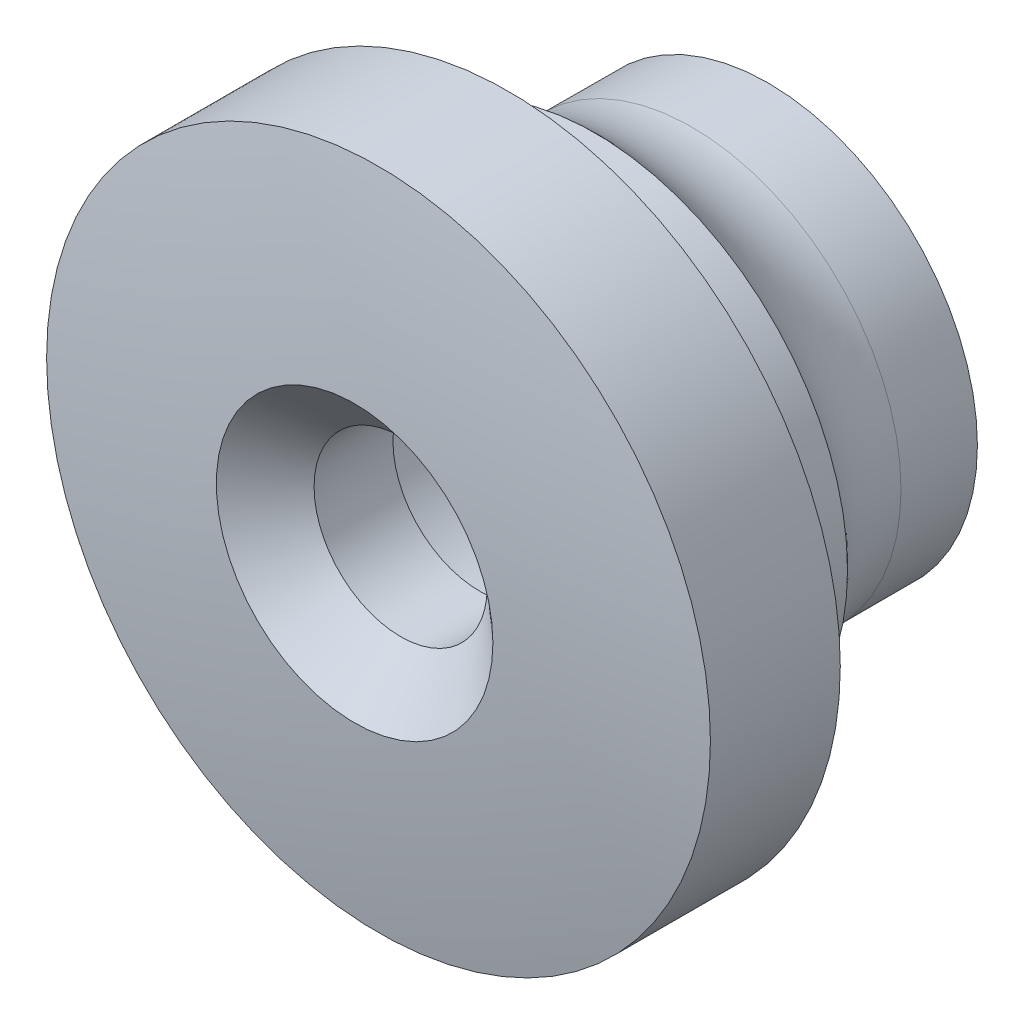
ISO-10303-21;
HEADER;
FILE_DESCRIPTION(('STEP AP214'),'2;1');
FILE_NAME('part.step','',(''),(''),'','','');
FILE_SCHEMA(('AUTOMOTIVE_DESIGN { 1 0 10303 214 1 1 1 1 }'));
ENDSEC;
DATA;
#1=APPLICATION_CONTEXT('core data for automotive mechanical design processes');
#2=APPLICATION_PROTOCOL_DEFINITION('international standard','automotive_design',2000,#1);
#3=PRODUCT_CONTEXT('',#1,'mechanical');
#4=PRODUCT('Part','Part','',(#3));
#5=PRODUCT_RELATED_PRODUCT_CATEGORY('part','',(#4));
#6=PRODUCT_DEFINITION_FORMATION('','',#4);
#7=PRODUCT_DEFINITION_CONTEXT('part definition',#1,'design');
#8=PRODUCT_DEFINITION('design','',#6,#7);
#9=PRODUCT_DEFINITION_SHAPE('','',#8);
#10=(LENGTH_UNIT() NAMED_UNIT(*) SI_UNIT(.MILLI.,.METRE.));
#11=(NAMED_UNIT(*) PLANE_ANGLE_UNIT() SI_UNIT($,.RADIAN.));
#12=(NAMED_UNIT(*) SI_UNIT($,.STERADIAN.) SOLID_ANGLE_UNIT());
#13=UNCERTAINTY_MEASURE_WITH_UNIT(LENGTH_MEASURE(1.E-05),#10,'distance_accuracy_value','');
#14=(GEOMETRIC_REPRESENTATION_CONTEXT(3) GLOBAL_UNCERTAINTY_ASSIGNED_CONTEXT((#13)) GLOBAL_UNIT_ASSIGNED_CONTEXT((#10,
#11,#12)) REPRESENTATION_CONTEXT('',''));
#15=CARTESIAN_POINT('',(0.,0.,0.));
#16=DIRECTION('',(0.,0.,1.));
#17=DIRECTION('',(1.,0.,0.));
#18=AXIS2_PLACEMENT_3D('',#15,#16,#17);
#19=CARTESIAN_POINT('',(0.,0.,0.));
#20=DIRECTION('',(0.,0.,-1.));
#21=DIRECTION('',(-1.,0.,0.));
#22=AXIS2_PLACEMENT_3D('',#19,#20,#21);
#23=CYLINDRICAL_SURFACE('',#22,3.00000000000001);
#24=CARTESIAN_POINT('',(0.,0.,3.73259543898158));
#25=DIRECTION('',(0.,0.,1.));
#26=DIRECTION('',(1.,0.,0.));
#27=AXIS2_PLACEMENT_3D('',#24,#25,#26);
#28=CIRCLE('',#27,3.00000000000001);
#29=CARTESIAN_POINT('',(3.00000000000003,0.,3.73259543898158));
#30=VERTEX_POINT('',#29);
#31=EDGE_CURVE('E46',#30,#30,#28,.T.);
#32=ORIENTED_EDGE('',*,*,#31,.T.);
#33=EDGE_LOOP('',(#32));
#34=FACE_BOUND('',#33,.T.);
#35=CARTESIAN_POINT('',(0.,0.,1.));
#36=DIRECTION('',(0.,0.,-1.));
#37=DIRECTION('',(-1.,0.,0.));
#38=AXIS2_PLACEMENT_3D('',#35,#36,#37);
#39=CIRCLE('',#38,3.00000000000001);
#40=CARTESIAN_POINT('',(-3.,0.,1.));
#41=VERTEX_POINT('',#40);
#42=EDGE_CURVE('E33',#41,#41,#39,.F.);
#43=ORIENTED_EDGE('',*,*,#42,.F.);
#44=EDGE_LOOP('',(#43));
#45=FACE_BOUND('',#44,.T.);
#46=ADVANCED_FACE('F29',(#34,#45),#23,.F.);
#47=CARTESIAN_POINT('',(0.,0.,0.));
#48=DIRECTION('',(0.,0.,1.));
#49=DIRECTION('',(1.,0.,0.));
#50=AXIS2_PLACEMENT_3D('',#47,#48,#49);
#51=PLANE('',#50);
#52=CARTESIAN_POINT('',(0.,0.,0.));
#53=DIRECTION('',(0.,0.,1.));
#54=DIRECTION('',(1.,0.,0.));
#55=AXIS2_PLACEMENT_3D('',#52,#53,#54);
#56=CIRCLE('',#55,11.5);
#57=CARTESIAN_POINT('',(11.5,0.,0.));
#58=VERTEX_POINT('',#57);
#59=EDGE_CURVE('E52',#58,#58,#56,.T.);
#60=ORIENTED_EDGE('',*,*,#59,.F.);
#61=EDGE_LOOP('',(#60));
#62=FACE_BOUND('',#61,.T.);
#63=CARTESIAN_POINT('',(0.,0.,0.));
#64=DIRECTION('',(0.,0.,-1.));
#65=DIRECTION('',(-1.,0.,0.));
#66=AXIS2_PLACEMENT_3D('',#63,#64,#65);
#67=CIRCLE('',#66,8.75);
#68=CARTESIAN_POINT('',(-8.74999999999999,0.,0.));
#69=VERTEX_POINT('',#68);
#70=EDGE_CURVE('E37',#69,#69,#67,.T.);
#71=ORIENTED_EDGE('',*,*,#70,.F.);
#72=EDGE_LOOP('',(#71));
#73=FACE_BOUND('',#72,.T.);
#74=ADVANCED_FACE('F88',(#62,#73),#51,.F.);
#75=CARTESIAN_POINT('',(0.,0.,4.5));
#76=DIRECTION('',(0.,0.,-1.));
#77=DIRECTION('',(-1.,0.,0.));
#78=AXIS2_PLACEMENT_3D('',#75,#76,#77);
#79=CYLINDRICAL_SURFACE('',#78,11.5);
#80=CARTESIAN_POINT('',(0.,0.,4.5));
#81=DIRECTION('',(0.,0.,1.));
#82=DIRECTION('',(1.,0.,0.));
#83=AXIS2_PLACEMENT_3D('',#80,#81,#82);
#84=CIRCLE('',#83,11.5);
#85=CARTESIAN_POINT('',(11.5,0.,4.5));
#86=VERTEX_POINT('',#85);
#87=EDGE_CURVE('E49',#86,#86,#84,.T.);
#88=ORIENTED_EDGE('',*,*,#87,.F.);
#89=EDGE_LOOP('',(#88));
#90=FACE_BOUND('',#89,.T.);
#91=ORIENTED_EDGE('',*,*,#59,.T.);
#92=EDGE_LOOP('',(#91));
#93=FACE_BOUND('',#92,.T.);
#94=ADVANCED_FACE('F94',(#90,#93),#79,.T.);
#95=CARTESIAN_POINT('',(0.,0.,-61.125));
#96=DIRECTION('',(0.,0.,1.));
#97=DIRECTION('',(1.,0.,0.));
#98=AXIS2_PLACEMENT_3D('',#95,#96,#97);
#99=SPHERICAL_SURFACE('',#98,66.625);
#100=CARTESIAN_POINT('',(0.,0.,5.32750093081577));
#101=DIRECTION('',(0.,0.,-1.));
#102=DIRECTION('',(-1.,0.,0.));
#103=AXIS2_PLACEMENT_3D('',#100,#101,#102);
#104=CIRCLE('',#103,4.79121540320671);
#105=CARTESIAN_POINT('',(4.79121540320731,0.,5.32750093081577));
#106=VERTEX_POINT('',#105);
#107=EDGE_CURVE('E41',#106,#106,#104,.T.);
#108=CARTESIAN_POINT('',(4.79121540320731,0.,5.32750093081577));
#109=CARTESIAN_POINT('',(4.86147602886873,0.,5.32243515059231));
#110=CARTESIAN_POINT('',(4.93172862035082,0.,5.31725793911036));
#111=CARTESIAN_POINT('',(5.07221702827427,0.,5.30668070748564));
#112=CARTESIAN_POINT('',(5.14245284471564,0.,5.30128068734288));
#113=CARTESIAN_POINT('',(5.28290699587557,0.,5.29025789225272));
#114=CARTESIAN_POINT('',(5.35312533059415,0.,5.28463511730533));
#115=CARTESIAN_POINT('',(5.49354381184756,0.,5.27316686930389));
#116=CARTESIAN_POINT('',(5.5637439583824,0.,5.26732139624984));
#117=CARTESIAN_POINT('',(5.70412535697826,0.,5.2554078108127));
#118=CARTESIAN_POINT('',(5.77430660903928,0.,5.24933969842961));
#119=CARTESIAN_POINT('',(5.91464951259078,0.,5.2369808953951));
#120=CARTESIAN_POINT('',(5.98481116408126,0.,5.23069020474369));
#121=CARTESIAN_POINT('',(6.12511416059129,0.,5.21788630846108));
#122=CARTESIAN_POINT('',(6.19525550561084,0.,5.21137310282989));
#123=CARTESIAN_POINT('',(6.33551718348312,0.,5.19812424211809));
#124=CARTESIAN_POINT('',(6.40563751633587,0.,5.19138858703749));
#125=CARTESIAN_POINT('',(6.54585646439003,0.,5.17769489519451));
#126=CARTESIAN_POINT('',(6.61595507959146,0.,5.17073685843213));
#127=CARTESIAN_POINT('',(6.756129887077,0.,5.15659847323081));
#128=CARTESIAN_POINT('',(6.82620607936112,0.,5.14941812479187));
#129=CARTESIAN_POINT('',(6.96633533597162,0.,5.13483518847931));
#130=CARTESIAN_POINT('',(7.03638840029802,0.,5.1274326006057));
#131=CARTESIAN_POINT('',(7.17647069618537,0.,5.11240525990161));
#132=CARTESIAN_POINT('',(7.24649992774633,0.,5.10478050707114));
#133=CARTESIAN_POINT('',(7.38653385353489,0.,5.08930891316642));
#134=CARTESIAN_POINT('',(7.4565385477625,0.,5.08146207209217));
#135=CARTESIAN_POINT('',(7.59652269456328,0.,5.06554638064738));
#136=CARTESIAN_POINT('',(7.66650214713646,0.,5.05747753027685));
#137=CARTESIAN_POINT('',(7.80643510656131,0.,5.04111790142063));
#138=CARTESIAN_POINT('',(7.87638861341298,0.,5.03282712293494));
#139=CARTESIAN_POINT('',(8.01626897758873,0.,5.01602372126241));
#140=CARTESIAN_POINT('',(8.08619583491281,0.,5.00751109807555));
#141=CARTESIAN_POINT('',(8.22602219649547,0.,4.99026409264665));
#142=CARTESIAN_POINT('',(8.29592170075404,0.,4.9815297104046));
#143=CARTESIAN_POINT('',(8.43569265294294,0.,4.9638392747424));
#144=CARTESIAN_POINT('',(8.50556410087326,0.,4.95488322132224));
#145=CARTESIAN_POINT('',(8.6452782374252,0.,4.93674953341116));
#146=CARTESIAN_POINT('',(8.71512092604681,0.,4.92757189892025));
#147=CARTESIAN_POINT('',(8.85477684129022,0.,4.90899514120434));
#148=CARTESIAN_POINT('',(8.92459006791201,0.,4.89959601797934));
#149=CARTESIAN_POINT('',(9.06418635676109,0.,4.88057637736037));
#150=CARTESIAN_POINT('',(9.13396941898837,0.,4.87095585996639));
#151=CARTESIAN_POINT('',(9.27350467695721,0.,4.85149352780201));
#152=CARTESIAN_POINT('',(9.34325687269877,0.,4.8416517130316));
#153=CARTESIAN_POINT('',(9.48272969591553,0.,4.82174688513338));
#154=CARTESIAN_POINT('',(9.55245032339072,0.,4.81168387200557));
#155=CARTESIAN_POINT('',(9.69185930861168,0.,4.7913367486371));
#156=CARTESIAN_POINT('',(9.76154766635744,0.,4.78105263839643));
#157=CARTESIAN_POINT('',(9.90089141098117,0.,4.76026342427118));
#158=CARTESIAN_POINT('',(9.97054679785913,0.,4.7497583203866));
#159=CARTESIAN_POINT('',(10.1098238999406,0.,4.72852722466613));
#160=CARTESIAN_POINT('',(10.1794456151442,0.,4.71780123283023));
#161=CARTESIAN_POINT('',(10.3186546734088,0.,4.69612846912128));
#162=CARTESIAN_POINT('',(10.3882420164699,0.,4.68518169724821));
#163=CARTESIAN_POINT('',(10.527381630328,0.,4.6630674836034));
#164=CARTESIAN_POINT('',(10.596933901125,0.,4.65190004183165));
#165=CARTESIAN_POINT('',(10.7360026706842,0.,4.6293446007367));
#166=CARTESIAN_POINT('',(10.8055191694464,0.,4.6179566014135));
#167=CARTESIAN_POINT('',(10.9445156955324,0.,4.59496015982456));
#168=CARTESIAN_POINT('',(11.0139957228563,0.,4.58335171755881));
#169=CARTESIAN_POINT('',(11.1529186070017,0.,4.55991450675249));
#170=CARTESIAN_POINT('',(11.2223614638232,0.,4.5480857382119));
#171=CARTESIAN_POINT('',(11.3612093083762,0.,4.52420799433399));
#172=CARTESIAN_POINT('',(11.4306142961076,0.,4.51215901899666));
#173=CARTESIAN_POINT('',(11.5,0.,4.5));
#174=B_SPLINE_CURVE_WITH_KNOTS('',3,(#108,#109,#110,#111,#112,#113,#114,#115,#116,#117,#118,
#119,#120,#121,#122,#123,#124,#125,#126,#127,#128,#129,#130,#131,#132,#133,#134,#135,#136,#137,
#138,#139,#140,#141,#142,#143,#144,#145,#146,#147,#148,#149,#150,#151,#152,#153,#154,#155,#156,
#157,#158,#159,#160,#161,#162,#163,#164,#165,#166,#167,#168,#169,#170,#171,#172,#173),
.UNSPECIFIED.,.F.,.F.,(4,2,2,2,2,2,2,2,2,2,2,2,2,2,2,2,2,2,2,2,2,2,2,2,2,2,2,2,2,2,2,2,4),(0.,
0.211328941186524,0.422657882373063,0.633986823559587,0.845315764746125,1.05664470593265,
1.26797364711917,1.47930258830571,1.69063152949224,1.90196047067876,2.1132894118653,
2.32461835305182,2.53594729423835,2.74727623542489,2.95860517661141,3.16993411779795,
3.38126305898447,3.592592000171,3.80392094135753,4.01524988254406,4.2265788237306,
4.43790776491712,4.64923670610364,4.86056564729018,5.0718945884767,5.28322352966323,
5.49455247084977,5.70588141203629,5.91721035322282,6.12853929440935,6.33986823559588,
6.55119717678241,6.76252611796894),.UNSPECIFIED.);
#175=EDGE_CURVE('BSEAM31',#106,#86,#174,.T.);
#176=ORIENTED_EDGE('',*,*,#107,.T.);
#177=ORIENTED_EDGE('',*,*,#87,.T.);
#178=ORIENTED_EDGE('',*,*,#175,.T.);
#179=ORIENTED_EDGE('',*,*,#175,.F.);
#180=EDGE_LOOP('',(#176,#178,#177,#179));
#181=FACE_BOUND('',#180,.T.);
#182=ADVANCED_FACE('F31',(#181),#99,.T.);
#183=CARTESIAN_POINT('',(0.,0.,3.73259543898158));
#184=DIRECTION('',(0.,0.,1.));
#185=DIRECTION('',(1.,0.,0.));
#186=AXIS2_PLACEMENT_3D('',#183,#184,#185);
#187=CONICAL_SURFACE('',#186,3.00000000000001,0.843308209083325);
#188=ORIENTED_EDGE('',*,*,#107,.F.);
#189=EDGE_LOOP('',(#188));
#190=FACE_BOUND('',#189,.T.);
#191=ORIENTED_EDGE('',*,*,#31,.F.);
#192=EDGE_LOOP('',(#191));
#193=FACE_BOUND('',#192,.T.);
#194=ADVANCED_FACE('F84',(#190,#193),#187,.F.);
#195=CARTESIAN_POINT('',(0.,0.,-3.));
#196=DIRECTION('',(0.,0.,1.));
#197=DIRECTION('',(1.,0.,0.));
#198=AXIS2_PLACEMENT_3D('',#195,#196,#197);
#199=CYLINDRICAL_SURFACE('',#198,8.75);
#200=CARTESIAN_POINT('',(0.,0.,-3.));
#201=DIRECTION('',(0.,0.,-1.));
#202=DIRECTION('',(-1.,0.,0.));
#203=AXIS2_PLACEMENT_3D('',#200,#201,#202);
#204=CIRCLE('',#203,8.75);
#205=CARTESIAN_POINT('',(-8.74999999999999,0.,-3.));
#206=VERTEX_POINT('',#205);
#207=EDGE_CURVE('E55',#206,#206,#204,.T.);
#208=ORIENTED_EDGE('',*,*,#207,.F.);
#209=EDGE_LOOP('',(#208));
#210=FACE_BOUND('',#209,.T.);
#211=ORIENTED_EDGE('',*,*,#70,.T.);
#212=EDGE_LOOP('',(#211));
#213=FACE_BOUND('',#212,.T.);
#214=ADVANCED_FACE('F79',(#210,#213),#199,.T.);
#215=CARTESIAN_POINT('',(0.,0.,-9.00000000000001));
#216=DIRECTION('',(0.,0.,1.));
#217=DIRECTION('',(1.,0.,0.));
#218=AXIS2_PLACEMENT_3D('',#215,#216,#217);
#219=CYLINDRICAL_SURFACE('',#218,7.25);
#220=CARTESIAN_POINT('',(0.,0.,-6.35410196624969));
#221=DIRECTION('',(0.,0.,1.));
#222=DIRECTION('',(1.,0.,0.));
#223=AXIS2_PLACEMENT_3D('',#220,#221,#222);
#224=CIRCLE('',#223,7.25);
#225=CARTESIAN_POINT('',(7.25000000000001,0.,-6.35410196624969));
#226=VERTEX_POINT('',#225);
#227=EDGE_CURVE('E10',#226,#226,#224,.F.);
#228=ORIENTED_EDGE('',*,*,#227,.T.);
#229=EDGE_LOOP('',(#228));
#230=FACE_BOUND('',#229,.T.);
#231=CARTESIAN_POINT('',(0.,0.,-9.00000000000001));
#232=DIRECTION('',(0.,0.,-1.));
#233=DIRECTION('',(-1.,0.,0.));
#234=AXIS2_PLACEMENT_3D('',#231,#232,#233);
#235=CIRCLE('',#234,7.25);
#236=CARTESIAN_POINT('',(-7.24999999999999,0.,-9.00000000000001));
#237=VERTEX_POINT('',#236);
#238=EDGE_CURVE('E57',#237,#237,#235,.T.);
#239=ORIENTED_EDGE('',*,*,#238,.F.);
#240=EDGE_LOOP('',(#239));
#241=FACE_BOUND('',#240,.T.);
#242=ADVANCED_FACE('F74',(#230,#241),#219,.T.);
#243=CARTESIAN_POINT('',(0.,0.,-9.00000000000001));
#244=DIRECTION('',(0.,0.,-1.));
#245=DIRECTION('',(-1.,0.,0.));
#246=AXIS2_PLACEMENT_3D('',#243,#244,#245);
#247=PLANE('',#246);
#248=CARTESIAN_POINT('',(0.,0.,-9.00000000000001));
#249=DIRECTION('',(0.,0.,-1.));
#250=DIRECTION('',(-1.,0.,0.));
#251=AXIS2_PLACEMENT_3D('',#248,#249,#250);
#252=CIRCLE('',#251,4.5);
#253=CARTESIAN_POINT('',(-4.49999999999999,0.,-9.00000000000001));
#254=VERTEX_POINT('',#253);
#255=EDGE_CURVE('E64',#254,#254,#252,.T.);
#256=ORIENTED_EDGE('',*,*,#255,.F.);
#257=EDGE_LOOP('',(#256));
#258=FACE_BOUND('',#257,.T.);
#259=ORIENTED_EDGE('',*,*,#238,.T.);
#260=EDGE_LOOP('',(#259));
#261=FACE_BOUND('',#260,.T.);
#262=ADVANCED_FACE('F70',(#258,#261),#247,.T.);
#263=CARTESIAN_POINT('',(0.,0.,-6.35410196624969));
#264=DIRECTION('',(0.,0.,1.));
#265=DIRECTION('',(1.,0.,0.));
#266=AXIS2_PLACEMENT_3D('',#263,#264,#265);
#267=TOROIDAL_SURFACE('',#266,11.75,4.5);
#268=ORIENTED_EDGE('',*,*,#207,.T.);
#269=EDGE_LOOP('',(#268));
#270=FACE_BOUND('',#269,.T.);
#271=ORIENTED_EDGE('',*,*,#227,.F.);
#272=EDGE_LOOP('',(#271));
#273=FACE_BOUND('',#272,.T.);
#274=ADVANCED_FACE('F73',(#270,#273),#267,.F.);
#275=CARTESIAN_POINT('',(0.,0.,1.));
#276=DIRECTION('',(0.,0.,-1.));
#277=DIRECTION('',(-1.,0.,0.));
#278=AXIS2_PLACEMENT_3D('',#275,#276,#277);
#279=PLANE('',#278);
#280=CARTESIAN_POINT('',(0.,0.,1.));
#281=DIRECTION('',(0.,0.,-1.));
#282=DIRECTION('',(-1.,0.,0.));
#283=AXIS2_PLACEMENT_3D('',#280,#281,#282);
#284=CIRCLE('',#283,4.5);
#285=CARTESIAN_POINT('',(-4.49999999999999,0.,1.));
#286=VERTEX_POINT('',#285);
#287=EDGE_CURVE('E61',#286,#286,#284,.T.);
#288=ORIENTED_EDGE('',*,*,#287,.T.);
#289=EDGE_LOOP('',(#288));
#290=FACE_BOUND('',#289,.T.);
#291=ORIENTED_EDGE('',*,*,#42,.T.);
#292=EDGE_LOOP('',(#291));
#293=FACE_BOUND('',#292,.T.);
#294=ADVANCED_FACE('F145',(#290,#293),#279,.T.);
#295=CARTESIAN_POINT('',(0.,0.,1.));
#296=DIRECTION('',(0.,0.,-1.));
#297=DIRECTION('',(-1.,0.,0.));
#298=AXIS2_PLACEMENT_3D('',#295,#296,#297);
#299=CYLINDRICAL_SURFACE('',#298,4.5);
#300=ORIENTED_EDGE('',*,*,#287,.F.);
#301=EDGE_LOOP('',(#300));
#302=FACE_BOUND('',#301,.T.);
#303=ORIENTED_EDGE('',*,*,#255,.T.);
#304=EDGE_LOOP('',(#303));
#305=FACE_BOUND('',#304,.T.);
#306=ADVANCED_FACE('F68',(#302,#305),#299,.F.);
#307=CLOSED_SHELL('',(#46,#74,#94,#182,#194,#214,#242,#262,#274,#294,#306));
#308=MANIFOLD_SOLID_BREP('B2',#307);
#309=ADVANCED_BREP_SHAPE_REPRESENTATION('',(#18,#308),#14);
#310=SHAPE_DEFINITION_REPRESENTATION(#9,#309);
ENDSEC;
END-ISO-10303-21;
